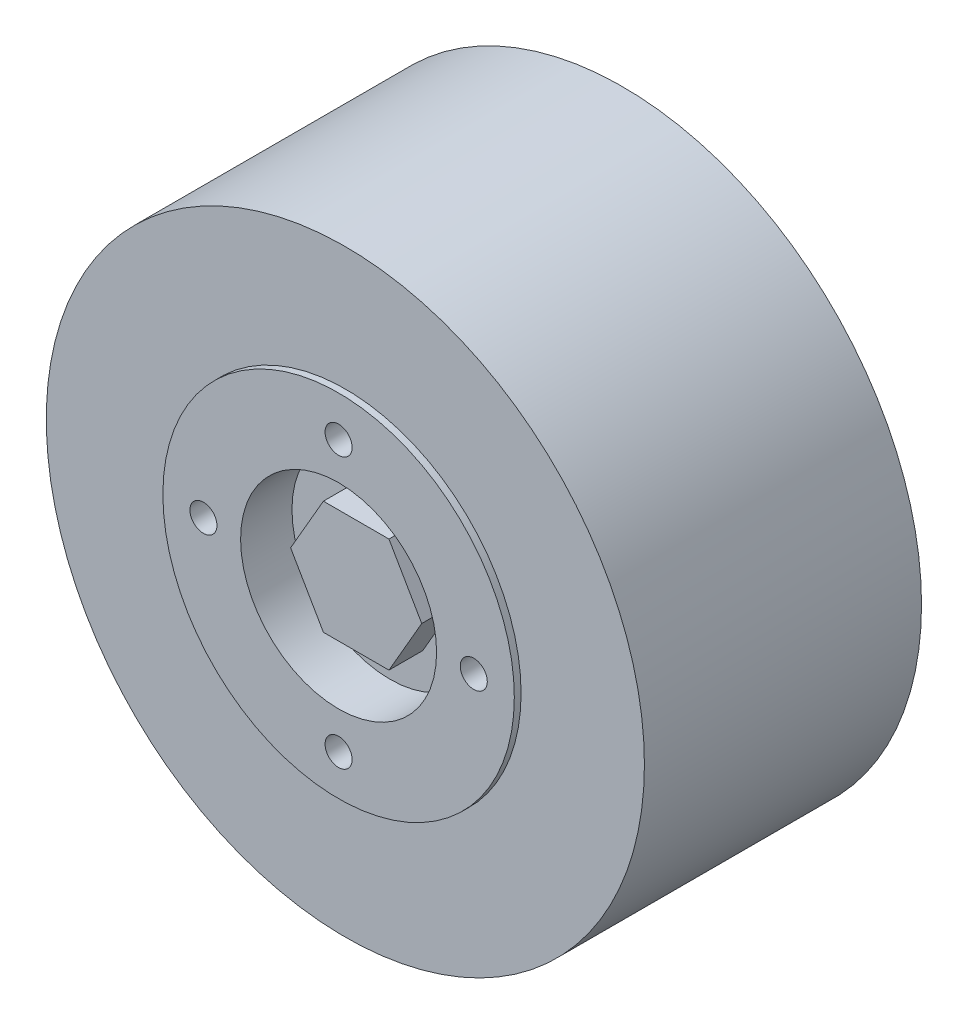
ISO-10303-21;
HEADER;
FILE_DESCRIPTION(('STEP AP214'),'2;1');
FILE_NAME('part.step','',(''),(''),'','','');
FILE_SCHEMA(('AUTOMOTIVE_DESIGN { 1 0 10303 214 1 1 1 1 }'));
ENDSEC;
DATA;
#1=APPLICATION_CONTEXT('core data for automotive mechanical design processes');
#2=APPLICATION_PROTOCOL_DEFINITION('international standard','automotive_design',2000,#1);
#3=PRODUCT_CONTEXT('',#1,'mechanical');
#4=PRODUCT('Part','Part','',(#3));
#5=PRODUCT_RELATED_PRODUCT_CATEGORY('part','',(#4));
#6=PRODUCT_DEFINITION_FORMATION('','',#4);
#7=PRODUCT_DEFINITION_CONTEXT('part definition',#1,'design');
#8=PRODUCT_DEFINITION('design','',#6,#7);
#9=PRODUCT_DEFINITION_SHAPE('','',#8);
#10=(LENGTH_UNIT() NAMED_UNIT(*) SI_UNIT(.MILLI.,.METRE.));
#11=(NAMED_UNIT(*) PLANE_ANGLE_UNIT() SI_UNIT($,.RADIAN.));
#12=(NAMED_UNIT(*) SI_UNIT($,.STERADIAN.) SOLID_ANGLE_UNIT());
#13=UNCERTAINTY_MEASURE_WITH_UNIT(LENGTH_MEASURE(1.E-05),#10,'distance_accuracy_value','');
#14=(GEOMETRIC_REPRESENTATION_CONTEXT(3) GLOBAL_UNCERTAINTY_ASSIGNED_CONTEXT((#13)) GLOBAL_UNIT_ASSIGNED_CONTEXT((#10,
#11,#12)) REPRESENTATION_CONTEXT('',''));
#15=CARTESIAN_POINT('',(0.,0.,0.));
#16=DIRECTION('',(0.,0.,1.));
#17=DIRECTION('',(1.,0.,0.));
#18=AXIS2_PLACEMENT_3D('',#15,#16,#17);
#19=CARTESIAN_POINT('',(0.,0.,34.4));
#20=DIRECTION('',(0.,0.,1.));
#21=DIRECTION('',(1.,0.,0.));
#22=AXIS2_PLACEMENT_3D('',#19,#20,#21);
#23=PLANE('',#22);
#24=CARTESIAN_POINT('',(0.,0.,34.4));
#25=DIRECTION('',(0.,0.,1.));
#26=DIRECTION('',(1.,0.,0.));
#27=AXIS2_PLACEMENT_3D('',#24,#25,#26);
#28=CIRCLE('',#27,14.5);
#29=CARTESIAN_POINT('',(14.5,0.,34.4));
#30=VERTEX_POINT('',#29);
#31=EDGE_CURVE('E166',#30,#30,#28,.T.);
#32=ORIENTED_EDGE('',*,*,#31,.T.);
#33=EDGE_LOOP('',(#32));
#34=FACE_BOUND('',#33,.T.);
#35=DIRECTION('',(-0.5,0.866025403784439,0.));
#36=VECTOR('',#35,1.);
#37=CARTESIAN_POINT('',(9.69948452238571,0.,34.4));
#38=LINE('',#37,#36);
#39=CARTESIAN_POINT('',(9.69948452238571,0.,34.4));
#40=VERTEX_POINT('',#39);
#41=CARTESIAN_POINT('',(4.84974226119285,8.40000000000001,34.4));
#42=VERTEX_POINT('',#41);
#43=EDGE_CURVE('E138',#40,#42,#38,.T.);
#44=ORIENTED_EDGE('',*,*,#43,.F.);
#45=DIRECTION('',(0.5,0.866025403784439,0.));
#46=VECTOR('',#45,1.);
#47=CARTESIAN_POINT('',(4.84974226119285,-8.40000000000001,34.4));
#48=LINE('',#47,#46);
#49=CARTESIAN_POINT('',(4.84974226119285,-8.40000000000001,34.4));
#50=VERTEX_POINT('',#49);
#51=EDGE_CURVE('E134',#50,#40,#48,.T.);
#52=ORIENTED_EDGE('',*,*,#51,.F.);
#53=DIRECTION('',(1.,0.,0.));
#54=VECTOR('',#53,1.);
#55=CARTESIAN_POINT('',(-4.84974226119286,-8.40000000000001,34.4));
#56=LINE('',#55,#54);
#57=CARTESIAN_POINT('',(-4.84974226119286,-8.40000000000001,34.4));
#58=VERTEX_POINT('',#57);
#59=EDGE_CURVE('E89',#58,#50,#56,.T.);
#60=ORIENTED_EDGE('',*,*,#59,.F.);
#61=DIRECTION('',(0.5,-0.866025403784438,0.));
#62=VECTOR('',#61,1.);
#63=CARTESIAN_POINT('',(-9.69948452238572,0.,34.4));
#64=LINE('',#63,#62);
#65=CARTESIAN_POINT('',(-9.69948452238572,0.,34.4));
#66=VERTEX_POINT('',#65);
#67=EDGE_CURVE('E146',#66,#58,#64,.T.);
#68=ORIENTED_EDGE('',*,*,#67,.F.);
#69=DIRECTION('',(-0.5,-0.866025403784439,0.));
#70=VECTOR('',#69,1.);
#71=CARTESIAN_POINT('',(-4.84974226119286,8.40000000000001,34.4));
#72=LINE('',#71,#70);
#73=CARTESIAN_POINT('',(-4.84974226119286,8.40000000000001,34.4));
#74=VERTEX_POINT('',#73);
#75=EDGE_CURVE('E120',#74,#66,#72,.T.);
#76=ORIENTED_EDGE('',*,*,#75,.F.);
#77=DIRECTION('',(-1.,0.,0.));
#78=VECTOR('',#77,1.);
#79=CARTESIAN_POINT('',(4.84974226119285,8.40000000000001,34.4));
#80=LINE('',#79,#78);
#81=EDGE_CURVE('E141',#42,#74,#80,.T.);
#82=ORIENTED_EDGE('',*,*,#81,.F.);
#83=EDGE_LOOP('',(#44,#52,#60,#68,#76,#82));
#84=FACE_BOUND('',#83,.T.);
#85=ADVANCED_FACE('F43',(#34,#84),#23,.T.);
#86=CARTESIAN_POINT('',(0.,0.,41.));
#87=DIRECTION('',(0.,0.,-1.));
#88=DIRECTION('',(-1.,0.,0.));
#89=AXIS2_PLACEMENT_3D('',#86,#87,#88);
#90=CYLINDRICAL_SURFACE('',#89,44.25);
#91=CARTESIAN_POINT('',(0.,0.,41.));
#92=DIRECTION('',(0.,0.,1.));
#93=DIRECTION('',(1.,0.,0.));
#94=AXIS2_PLACEMENT_3D('',#91,#92,#93);
#95=CIRCLE('',#94,44.25);
#96=CARTESIAN_POINT('',(44.25,0.,41.));
#97=VERTEX_POINT('',#96);
#98=EDGE_CURVE('E255',#97,#97,#95,.T.);
#99=ORIENTED_EDGE('',*,*,#98,.F.);
#100=EDGE_LOOP('',(#99));
#101=FACE_BOUND('',#100,.T.);
#102=CARTESIAN_POINT('',(0.,0.,0.));
#103=DIRECTION('',(0.,0.,1.));
#104=DIRECTION('',(1.,0.,0.));
#105=AXIS2_PLACEMENT_3D('',#102,#103,#104);
#106=CIRCLE('',#105,44.25);
#107=CARTESIAN_POINT('',(44.25,0.,0.));
#108=VERTEX_POINT('',#107);
#109=EDGE_CURVE('E47',#108,#108,#106,.T.);
#110=ORIENTED_EDGE('',*,*,#109,.T.);
#111=EDGE_LOOP('',(#110));
#112=FACE_BOUND('',#111,.T.);
#113=ADVANCED_FACE('F45',(#101,#112),#90,.T.);
#114=CARTESIAN_POINT('',(0.,0.,41.));
#115=DIRECTION('',(0.,0.,1.));
#116=DIRECTION('',(1.,0.,0.));
#117=AXIS2_PLACEMENT_3D('',#114,#115,#116);
#118=PLANE('',#117);
#119=CARTESIAN_POINT('',(0.,0.,41.));
#120=DIRECTION('',(0.,0.,1.));
#121=DIRECTION('',(1.,0.,0.));
#122=AXIS2_PLACEMENT_3D('',#119,#120,#121);
#123=CIRCLE('',#122,26.);
#124=CARTESIAN_POINT('',(26.,0.,41.));
#125=VERTEX_POINT('',#124);
#126=EDGE_CURVE('E53',#125,#125,#123,.T.);
#127=ORIENTED_EDGE('',*,*,#126,.F.);
#128=EDGE_LOOP('',(#127));
#129=FACE_BOUND('',#128,.T.);
#130=ORIENTED_EDGE('',*,*,#98,.T.);
#131=EDGE_LOOP('',(#130));
#132=FACE_BOUND('',#131,.T.);
#133=ADVANCED_FACE('F268',(#129,#132),#118,.T.);
#134=CARTESIAN_POINT('',(0.,0.,0.));
#135=DIRECTION('',(0.,0.,1.));
#136=DIRECTION('',(1.,0.,0.));
#137=AXIS2_PLACEMENT_3D('',#134,#135,#136);
#138=PLANE('',#137);
#139=CARTESIAN_POINT('',(0.,0.,0.));
#140=DIRECTION('',(0.,0.,-1.));
#141=DIRECTION('',(-1.,0.,0.));
#142=AXIS2_PLACEMENT_3D('',#139,#140,#141);
#143=CIRCLE('',#142,21.);
#144=CARTESIAN_POINT('',(-21.,0.,0.));
#145=VERTEX_POINT('',#144);
#146=EDGE_CURVE('E11',#145,#145,#143,.T.);
#147=ORIENTED_EDGE('',*,*,#146,.F.);
#148=EDGE_LOOP('',(#147));
#149=FACE_BOUND('',#148,.T.);
#150=ORIENTED_EDGE('',*,*,#109,.F.);
#151=EDGE_LOOP('',(#150));
#152=FACE_BOUND('',#151,.T.);
#153=ADVANCED_FACE('F265',(#149,#152),#138,.F.);
#154=CARTESIAN_POINT('',(0.,0.,42.));
#155=DIRECTION('',(0.,0.,-1.));
#156=DIRECTION('',(-1.,0.,0.));
#157=AXIS2_PLACEMENT_3D('',#154,#155,#156);
#158=CYLINDRICAL_SURFACE('',#157,26.);
#159=CARTESIAN_POINT('',(0.,0.,42.));
#160=DIRECTION('',(0.,0.,1.));
#161=DIRECTION('',(1.,0.,0.));
#162=AXIS2_PLACEMENT_3D('',#159,#160,#161);
#163=CIRCLE('',#162,26.);
#164=CARTESIAN_POINT('',(26.,0.,42.));
#165=VERTEX_POINT('',#164);
#166=EDGE_CURVE('E222',#165,#165,#163,.T.);
#167=ORIENTED_EDGE('',*,*,#166,.F.);
#168=EDGE_LOOP('',(#167));
#169=FACE_BOUND('',#168,.T.);
#170=ORIENTED_EDGE('',*,*,#126,.T.);
#171=EDGE_LOOP('',(#170));
#172=FACE_BOUND('',#171,.T.);
#173=ADVANCED_FACE('F267',(#169,#172),#158,.T.);
#174=CARTESIAN_POINT('',(0.,0.,42.));
#175=DIRECTION('',(0.,0.,1.));
#176=DIRECTION('',(1.,0.,0.));
#177=AXIS2_PLACEMENT_3D('',#174,#175,#176);
#178=PLANE('',#177);
#179=CARTESIAN_POINT('',(0.,0.,42.));
#180=DIRECTION('',(0.,0.,1.));
#181=DIRECTION('',(1.,0.,0.));
#182=AXIS2_PLACEMENT_3D('',#179,#180,#181);
#183=CIRCLE('',#182,14.5);
#184=CARTESIAN_POINT('',(14.5,0.,42.));
#185=VERTEX_POINT('',#184);
#186=EDGE_CURVE('E165',#185,#185,#183,.T.);
#187=ORIENTED_EDGE('',*,*,#186,.F.);
#188=EDGE_LOOP('',(#187));
#189=FACE_BOUND('',#188,.T.);
#190=CARTESIAN_POINT('',(0.,20.,42.));
#191=DIRECTION('',(0.,0.,1.));
#192=DIRECTION('',(1.,0.,0.));
#193=AXIS2_PLACEMENT_3D('',#190,#191,#192);
#194=CIRCLE('',#193,2.);
#195=CARTESIAN_POINT('',(2.,20.,42.));
#196=VERTEX_POINT('',#195);
#197=EDGE_CURVE('E223',#196,#196,#194,.T.);
#198=ORIENTED_EDGE('',*,*,#197,.F.);
#199=EDGE_LOOP('',(#198));
#200=FACE_BOUND('',#199,.T.);
#201=CARTESIAN_POINT('',(20.,0.,42.));
#202=DIRECTION('',(0.,0.,1.));
#203=DIRECTION('',(1.,0.,0.));
#204=AXIS2_PLACEMENT_3D('',#201,#202,#203);
#205=CIRCLE('',#204,2.);
#206=CARTESIAN_POINT('',(22.,0.,42.));
#207=VERTEX_POINT('',#206);
#208=EDGE_CURVE('E227',#207,#207,#205,.T.);
#209=ORIENTED_EDGE('',*,*,#208,.F.);
#210=EDGE_LOOP('',(#209));
#211=FACE_BOUND('',#210,.T.);
#212=CARTESIAN_POINT('',(0.,-20.,42.));
#213=DIRECTION('',(0.,0.,1.));
#214=DIRECTION('',(1.,0.,0.));
#215=AXIS2_PLACEMENT_3D('',#212,#213,#214);
#216=CIRCLE('',#215,2.);
#217=CARTESIAN_POINT('',(2.,-20.,42.));
#218=VERTEX_POINT('',#217);
#219=EDGE_CURVE('E235',#218,#218,#216,.T.);
#220=ORIENTED_EDGE('',*,*,#219,.F.);
#221=EDGE_LOOP('',(#220));
#222=FACE_BOUND('',#221,.T.);
#223=CARTESIAN_POINT('',(-20.,0.,42.));
#224=DIRECTION('',(0.,0.,1.));
#225=DIRECTION('',(1.,0.,0.));
#226=AXIS2_PLACEMENT_3D('',#223,#224,#225);
#227=CIRCLE('',#226,2.);
#228=CARTESIAN_POINT('',(-18.,0.,42.));
#229=VERTEX_POINT('',#228);
#230=EDGE_CURVE('E243',#229,#229,#227,.T.);
#231=ORIENTED_EDGE('',*,*,#230,.F.);
#232=EDGE_LOOP('',(#231));
#233=FACE_BOUND('',#232,.T.);
#234=ORIENTED_EDGE('',*,*,#166,.T.);
#235=EDGE_LOOP('',(#234));
#236=FACE_BOUND('',#235,.T.);
#237=ADVANCED_FACE('F274',(#189,#200,#211,#222,#233,#236),#178,.T.);
#238=CARTESIAN_POINT('',(-20.,0.,32.));
#239=DIRECTION('',(0.,0.,1.));
#240=DIRECTION('',(1.,0.,0.));
#241=AXIS2_PLACEMENT_3D('',#238,#239,#240);
#242=CYLINDRICAL_SURFACE('',#241,2.);
#243=CARTESIAN_POINT('',(-20.,0.,32.));
#244=DIRECTION('',(0.,0.,1.));
#245=DIRECTION('',(1.,0.,0.));
#246=AXIS2_PLACEMENT_3D('',#243,#244,#245);
#247=CIRCLE('',#246,2.);
#248=CARTESIAN_POINT('',(-18.,0.,32.));
#249=VERTEX_POINT('',#248);
#250=EDGE_CURVE('E216',#249,#249,#247,.T.);
#251=ORIENTED_EDGE('',*,*,#250,.F.);
#252=EDGE_LOOP('',(#251));
#253=FACE_BOUND('',#252,.T.);
#254=ORIENTED_EDGE('',*,*,#230,.T.);
#255=EDGE_LOOP('',(#254));
#256=FACE_BOUND('',#255,.T.);
#257=ADVANCED_FACE('F369',(#253,#256),#242,.F.);
#258=CARTESIAN_POINT('',(-20.,0.,32.));
#259=DIRECTION('',(0.,0.,1.));
#260=DIRECTION('',(1.,0.,0.));
#261=AXIS2_PLACEMENT_3D('',#258,#259,#260);
#262=PLANE('',#261);
#263=ORIENTED_EDGE('',*,*,#250,.T.);
#264=EDGE_LOOP('',(#263));
#265=FACE_BOUND('',#264,.T.);
#266=ADVANCED_FACE('F364',(#265),#262,.T.);
#267=CARTESIAN_POINT('',(0.,-20.,32.));
#268=DIRECTION('',(0.,0.,1.));
#269=DIRECTION('',(1.,0.,0.));
#270=AXIS2_PLACEMENT_3D('',#267,#268,#269);
#271=CYLINDRICAL_SURFACE('',#270,2.);
#272=CARTESIAN_POINT('',(0.,-20.,32.));
#273=DIRECTION('',(0.,0.,1.));
#274=DIRECTION('',(1.,0.,0.));
#275=AXIS2_PLACEMENT_3D('',#272,#273,#274);
#276=CIRCLE('',#275,2.);
#277=CARTESIAN_POINT('',(2.,-20.,32.));
#278=VERTEX_POINT('',#277);
#279=EDGE_CURVE('E239',#278,#278,#276,.T.);
#280=ORIENTED_EDGE('',*,*,#279,.F.);
#281=EDGE_LOOP('',(#280));
#282=FACE_BOUND('',#281,.T.);
#283=ORIENTED_EDGE('',*,*,#219,.T.);
#284=EDGE_LOOP('',(#283));
#285=FACE_BOUND('',#284,.T.);
#286=ADVANCED_FACE('F361',(#282,#285),#271,.F.);
#287=CARTESIAN_POINT('',(0.,-20.,32.));
#288=DIRECTION('',(0.,0.,1.));
#289=DIRECTION('',(1.,0.,0.));
#290=AXIS2_PLACEMENT_3D('',#287,#288,#289);
#291=PLANE('',#290);
#292=ORIENTED_EDGE('',*,*,#279,.T.);
#293=EDGE_LOOP('',(#292));
#294=FACE_BOUND('',#293,.T.);
#295=ADVANCED_FACE('F356',(#294),#291,.T.);
#296=CARTESIAN_POINT('',(20.,0.,32.));
#297=DIRECTION('',(0.,0.,1.));
#298=DIRECTION('',(1.,0.,0.));
#299=AXIS2_PLACEMENT_3D('',#296,#297,#298);
#300=CYLINDRICAL_SURFACE('',#299,2.);
#301=CARTESIAN_POINT('',(20.,0.,32.));
#302=DIRECTION('',(0.,0.,1.));
#303=DIRECTION('',(1.,0.,0.));
#304=AXIS2_PLACEMENT_3D('',#301,#302,#303);
#305=CIRCLE('',#304,2.);
#306=CARTESIAN_POINT('',(22.,0.,32.));
#307=VERTEX_POINT('',#306);
#308=EDGE_CURVE('E231',#307,#307,#305,.T.);
#309=ORIENTED_EDGE('',*,*,#308,.F.);
#310=EDGE_LOOP('',(#309));
#311=FACE_BOUND('',#310,.T.);
#312=ORIENTED_EDGE('',*,*,#208,.T.);
#313=EDGE_LOOP('',(#312));
#314=FACE_BOUND('',#313,.T.);
#315=ADVANCED_FACE('F353',(#311,#314),#300,.F.);
#316=CARTESIAN_POINT('',(20.,0.,32.));
#317=DIRECTION('',(0.,0.,1.));
#318=DIRECTION('',(1.,0.,0.));
#319=AXIS2_PLACEMENT_3D('',#316,#317,#318);
#320=PLANE('',#319);
#321=ORIENTED_EDGE('',*,*,#308,.T.);
#322=EDGE_LOOP('',(#321));
#323=FACE_BOUND('',#322,.T.);
#324=ADVANCED_FACE('F351',(#323),#320,.T.);
#325=CARTESIAN_POINT('',(0.,20.,32.));
#326=DIRECTION('',(0.,0.,1.));
#327=DIRECTION('',(1.,0.,0.));
#328=AXIS2_PLACEMENT_3D('',#325,#326,#327);
#329=CYLINDRICAL_SURFACE('',#328,2.);
#330=CARTESIAN_POINT('',(0.,20.,32.));
#331=DIRECTION('',(0.,0.,1.));
#332=DIRECTION('',(1.,0.,0.));
#333=AXIS2_PLACEMENT_3D('',#330,#331,#332);
#334=CIRCLE('',#333,2.);
#335=CARTESIAN_POINT('',(2.,20.,32.));
#336=VERTEX_POINT('',#335);
#337=EDGE_CURVE('E218',#336,#336,#334,.T.);
#338=ORIENTED_EDGE('',*,*,#337,.F.);
#339=EDGE_LOOP('',(#338));
#340=FACE_BOUND('',#339,.T.);
#341=ORIENTED_EDGE('',*,*,#197,.T.);
#342=EDGE_LOOP('',(#341));
#343=FACE_BOUND('',#342,.T.);
#344=ADVANCED_FACE('F347',(#340,#343),#329,.F.);
#345=CARTESIAN_POINT('',(0.,20.,32.));
#346=DIRECTION('',(0.,0.,1.));
#347=DIRECTION('',(1.,0.,0.));
#348=AXIS2_PLACEMENT_3D('',#345,#346,#347);
#349=PLANE('',#348);
#350=ORIENTED_EDGE('',*,*,#337,.T.);
#351=EDGE_LOOP('',(#350));
#352=FACE_BOUND('',#351,.T.);
#353=ADVANCED_FACE('F343',(#352),#349,.T.);
#354=CARTESIAN_POINT('',(0.,0.,-1.));
#355=DIRECTION('',(0.,0.,1.));
#356=DIRECTION('',(1.,0.,0.));
#357=AXIS2_PLACEMENT_3D('',#354,#355,#356);
#358=CYLINDRICAL_SURFACE('',#357,21.);
#359=CARTESIAN_POINT('',(0.,0.,-1.));
#360=DIRECTION('',(0.,0.,-1.));
#361=DIRECTION('',(-1.,0.,0.));
#362=AXIS2_PLACEMENT_3D('',#359,#360,#361);
#363=CIRCLE('',#362,21.);
#364=CARTESIAN_POINT('',(-21.,0.,-1.));
#365=VERTEX_POINT('',#364);
#366=EDGE_CURVE('E210',#365,#365,#363,.T.);
#367=ORIENTED_EDGE('',*,*,#366,.F.);
#368=EDGE_LOOP('',(#367));
#369=FACE_BOUND('',#368,.T.);
#370=ORIENTED_EDGE('',*,*,#146,.T.);
#371=EDGE_LOOP('',(#370));
#372=FACE_BOUND('',#371,.T.);
#373=ADVANCED_FACE('F339',(#369,#372),#358,.T.);
#374=CARTESIAN_POINT('',(0.,0.,-1.));
#375=DIRECTION('',(0.,0.,-1.));
#376=DIRECTION('',(-1.,0.,0.));
#377=AXIS2_PLACEMENT_3D('',#374,#375,#376);
#378=PLANE('',#377);
#379=CARTESIAN_POINT('',(0.,0.,-1.));
#380=DIRECTION('',(0.,0.,-1.));
#381=DIRECTION('',(-1.,0.,0.));
#382=AXIS2_PLACEMENT_3D('',#379,#380,#381);
#383=CIRCLE('',#382,1.5);
#384=CARTESIAN_POINT('',(-1.5,0.,-1.));
#385=VERTEX_POINT('',#384);
#386=EDGE_CURVE('E170',#385,#385,#383,.T.);
#387=ORIENTED_EDGE('',*,*,#386,.F.);
#388=EDGE_LOOP('',(#387));
#389=FACE_BOUND('',#388,.T.);
#390=CARTESIAN_POINT('',(-15.5,0.,-1.));
#391=DIRECTION('',(0.,0.,-1.));
#392=DIRECTION('',(0.,-1.,0.));
#393=AXIS2_PLACEMENT_3D('',#390,#391,#392);
#394=CIRCLE('',#393,1.5);
#395=CARTESIAN_POINT('',(-15.5,-1.50000000000005,-1.));
#396=VERTEX_POINT('',#395);
#397=EDGE_CURVE('E187',#396,#396,#394,.T.);
#398=ORIENTED_EDGE('',*,*,#397,.F.);
#399=EDGE_LOOP('',(#398));
#400=FACE_BOUND('',#399,.T.);
#401=CARTESIAN_POINT('',(0.,-15.5,-1.));
#402=DIRECTION('',(0.,0.,-1.));
#403=DIRECTION('',(1.,0.,0.));
#404=AXIS2_PLACEMENT_3D('',#401,#402,#403);
#405=CIRCLE('',#404,1.5);
#406=CARTESIAN_POINT('',(1.5,-15.5,-1.));
#407=VERTEX_POINT('',#406);
#408=EDGE_CURVE('E195',#407,#407,#405,.T.);
#409=ORIENTED_EDGE('',*,*,#408,.F.);
#410=EDGE_LOOP('',(#409));
#411=FACE_BOUND('',#410,.T.);
#412=CARTESIAN_POINT('',(15.5,1.62353882256206E-13,-1.));
#413=DIRECTION('',(0.,0.,-1.));
#414=DIRECTION('',(0.,1.,0.));
#415=AXIS2_PLACEMENT_3D('',#412,#413,#414);
#416=CIRCLE('',#415,1.5);
#417=CARTESIAN_POINT('',(15.5,1.50000000000016,-1.));
#418=VERTEX_POINT('',#417);
#419=EDGE_CURVE('E178',#418,#418,#416,.T.);
#420=ORIENTED_EDGE('',*,*,#419,.F.);
#421=EDGE_LOOP('',(#420));
#422=FACE_BOUND('',#421,.T.);
#423=CARTESIAN_POINT('',(0.,15.5,-1.));
#424=DIRECTION('',(0.,0.,-1.));
#425=DIRECTION('',(-1.,0.,0.));
#426=AXIS2_PLACEMENT_3D('',#423,#424,#425);
#427=CIRCLE('',#426,1.5);
#428=CARTESIAN_POINT('',(-1.5,15.5,-1.));
#429=VERTEX_POINT('',#428);
#430=EDGE_CURVE('E186',#429,#429,#427,.T.);
#431=ORIENTED_EDGE('',*,*,#430,.F.);
#432=EDGE_LOOP('',(#431));
#433=FACE_BOUND('',#432,.T.);
#434=ORIENTED_EDGE('',*,*,#366,.T.);
#435=EDGE_LOOP('',(#434));
#436=FACE_BOUND('',#435,.T.);
#437=ADVANCED_FACE('F335',(#389,#400,#411,#422,#433,#436),#378,.T.);
#438=CARTESIAN_POINT('',(0.,15.5,9.));
#439=DIRECTION('',(0.,0.,-1.));
#440=DIRECTION('',(-1.,0.,0.));
#441=AXIS2_PLACEMENT_3D('',#438,#439,#440);
#442=CYLINDRICAL_SURFACE('',#441,1.5);
#443=CARTESIAN_POINT('',(0.,15.5,9.));
#444=DIRECTION('',(0.,0.,-1.));
#445=DIRECTION('',(-1.,0.,0.));
#446=AXIS2_PLACEMENT_3D('',#443,#444,#445);
#447=CIRCLE('',#446,1.5);
#448=CARTESIAN_POINT('',(-1.5,15.5,9.));
#449=VERTEX_POINT('',#448);
#450=EDGE_CURVE('E206',#449,#449,#447,.T.);
#451=ORIENTED_EDGE('',*,*,#450,.F.);
#452=EDGE_LOOP('',(#451));
#453=FACE_BOUND('',#452,.T.);
#454=ORIENTED_EDGE('',*,*,#430,.T.);
#455=EDGE_LOOP('',(#454));
#456=FACE_BOUND('',#455,.T.);
#457=ADVANCED_FACE('F331',(#453,#456),#442,.F.);
#458=CARTESIAN_POINT('',(0.,15.5,9.));
#459=DIRECTION('',(0.,0.,-1.));
#460=DIRECTION('',(-1.,0.,0.));
#461=AXIS2_PLACEMENT_3D('',#458,#459,#460);
#462=PLANE('',#461);
#463=ORIENTED_EDGE('',*,*,#450,.T.);
#464=EDGE_LOOP('',(#463));
#465=FACE_BOUND('',#464,.T.);
#466=ADVANCED_FACE('F327',(#465),#462,.T.);
#467=CARTESIAN_POINT('',(15.5,1.62353882256206E-13,9.));
#468=DIRECTION('',(0.,0.,-1.));
#469=DIRECTION('',(-1.,0.,0.));
#470=AXIS2_PLACEMENT_3D('',#467,#468,#469);
#471=CYLINDRICAL_SURFACE('',#470,1.5);
#472=CARTESIAN_POINT('',(15.5,1.62353882256206E-13,9.));
#473=DIRECTION('',(0.,0.,-1.));
#474=DIRECTION('',(0.,1.,0.));
#475=AXIS2_PLACEMENT_3D('',#472,#473,#474);
#476=CIRCLE('',#475,1.5);
#477=CARTESIAN_POINT('',(15.5,1.50000000000016,9.));
#478=VERTEX_POINT('',#477);
#479=EDGE_CURVE('E199',#478,#478,#476,.T.);
#480=ORIENTED_EDGE('',*,*,#479,.F.);
#481=EDGE_LOOP('',(#480));
#482=FACE_BOUND('',#481,.T.);
#483=ORIENTED_EDGE('',*,*,#419,.T.);
#484=EDGE_LOOP('',(#483));
#485=FACE_BOUND('',#484,.T.);
#486=ADVANCED_FACE('F323',(#482,#485),#471,.F.);
#487=CARTESIAN_POINT('',(15.5,1.62353882256206E-13,9.));
#488=DIRECTION('',(0.,0.,-1.));
#489=DIRECTION('',(0.,1.,0.));
#490=AXIS2_PLACEMENT_3D('',#487,#488,#489);
#491=PLANE('',#490);
#492=ORIENTED_EDGE('',*,*,#479,.T.);
#493=EDGE_LOOP('',(#492));
#494=FACE_BOUND('',#493,.T.);
#495=ADVANCED_FACE('F319',(#494),#491,.T.);
#496=CARTESIAN_POINT('',(0.,-15.5,9.));
#497=DIRECTION('',(0.,0.,-1.));
#498=DIRECTION('',(-1.,0.,0.));
#499=AXIS2_PLACEMENT_3D('',#496,#497,#498);
#500=CYLINDRICAL_SURFACE('',#499,1.5);
#501=CARTESIAN_POINT('',(0.,-15.5,9.));
#502=DIRECTION('',(0.,0.,-1.));
#503=DIRECTION('',(1.,0.,0.));
#504=AXIS2_PLACEMENT_3D('',#501,#502,#503);
#505=CIRCLE('',#504,1.5);
#506=CARTESIAN_POINT('',(1.5,-15.5,9.));
#507=VERTEX_POINT('',#506);
#508=EDGE_CURVE('E191',#507,#507,#505,.T.);
#509=ORIENTED_EDGE('',*,*,#508,.F.);
#510=EDGE_LOOP('',(#509));
#511=FACE_BOUND('',#510,.T.);
#512=ORIENTED_EDGE('',*,*,#408,.T.);
#513=EDGE_LOOP('',(#512));
#514=FACE_BOUND('',#513,.T.);
#515=ADVANCED_FACE('F315',(#511,#514),#500,.F.);
#516=CARTESIAN_POINT('',(0.,-15.5,9.));
#517=DIRECTION('',(0.,0.,-1.));
#518=DIRECTION('',(1.,0.,0.));
#519=AXIS2_PLACEMENT_3D('',#516,#517,#518);
#520=PLANE('',#519);
#521=ORIENTED_EDGE('',*,*,#508,.T.);
#522=EDGE_LOOP('',(#521));
#523=FACE_BOUND('',#522,.T.);
#524=ADVANCED_FACE('F311',(#523),#520,.T.);
#525=CARTESIAN_POINT('',(-15.5,0.,9.));
#526=DIRECTION('',(0.,0.,-1.));
#527=DIRECTION('',(-1.,0.,0.));
#528=AXIS2_PLACEMENT_3D('',#525,#526,#527);
#529=CYLINDRICAL_SURFACE('',#528,1.5);
#530=CARTESIAN_POINT('',(-15.5,0.,9.));
#531=DIRECTION('',(0.,0.,-1.));
#532=DIRECTION('',(0.,-1.,0.));
#533=AXIS2_PLACEMENT_3D('',#530,#531,#532);
#534=CIRCLE('',#533,1.5);
#535=CARTESIAN_POINT('',(-15.5,-1.50000000000005,9.));
#536=VERTEX_POINT('',#535);
#537=EDGE_CURVE('E182',#536,#536,#534,.T.);
#538=ORIENTED_EDGE('',*,*,#537,.F.);
#539=EDGE_LOOP('',(#538));
#540=FACE_BOUND('',#539,.T.);
#541=ORIENTED_EDGE('',*,*,#397,.T.);
#542=EDGE_LOOP('',(#541));
#543=FACE_BOUND('',#542,.T.);
#544=ADVANCED_FACE('F307',(#540,#543),#529,.F.);
#545=CARTESIAN_POINT('',(-15.5,0.,9.));
#546=DIRECTION('',(0.,0.,-1.));
#547=DIRECTION('',(0.,-1.,0.));
#548=AXIS2_PLACEMENT_3D('',#545,#546,#547);
#549=PLANE('',#548);
#550=ORIENTED_EDGE('',*,*,#537,.T.);
#551=EDGE_LOOP('',(#550));
#552=FACE_BOUND('',#551,.T.);
#553=ADVANCED_FACE('F303',(#552),#549,.T.);
#554=CARTESIAN_POINT('',(0.,0.,-7.));
#555=DIRECTION('',(0.,0.,1.));
#556=DIRECTION('',(1.,0.,0.));
#557=AXIS2_PLACEMENT_3D('',#554,#555,#556);
#558=CYLINDRICAL_SURFACE('',#557,1.5);
#559=CARTESIAN_POINT('',(0.,0.,-7.));
#560=DIRECTION('',(0.,0.,-1.));
#561=DIRECTION('',(-1.,0.,0.));
#562=AXIS2_PLACEMENT_3D('',#559,#560,#561);
#563=CIRCLE('',#562,1.5);
#564=CARTESIAN_POINT('',(-1.5,0.,-7.));
#565=VERTEX_POINT('',#564);
#566=EDGE_CURVE('E174',#565,#565,#563,.T.);
#567=ORIENTED_EDGE('',*,*,#566,.F.);
#568=EDGE_LOOP('',(#567));
#569=FACE_BOUND('',#568,.T.);
#570=ORIENTED_EDGE('',*,*,#386,.T.);
#571=EDGE_LOOP('',(#570));
#572=FACE_BOUND('',#571,.T.);
#573=ADVANCED_FACE('F299',(#569,#572),#558,.T.);
#574=CARTESIAN_POINT('',(0.,0.,-7.));
#575=DIRECTION('',(0.,0.,-1.));
#576=DIRECTION('',(-1.,0.,0.));
#577=AXIS2_PLACEMENT_3D('',#574,#575,#576);
#578=PLANE('',#577);
#579=ORIENTED_EDGE('',*,*,#566,.T.);
#580=EDGE_LOOP('',(#579));
#581=FACE_BOUND('',#580,.T.);
#582=ADVANCED_FACE('F295',(#581),#578,.T.);
#583=CARTESIAN_POINT('',(0.,0.,34.4));
#584=DIRECTION('',(0.,0.,1.));
#585=DIRECTION('',(1.,0.,0.));
#586=AXIS2_PLACEMENT_3D('',#583,#584,#585);
#587=CYLINDRICAL_SURFACE('',#586,14.5);
#588=CARTESIAN_POINT('',(14.5,0.,34.4));
#589=CARTESIAN_POINT('',(14.5,0.,34.4791666666667));
#590=CARTESIAN_POINT('',(14.5,0.,34.5583333333333));
#591=CARTESIAN_POINT('',(14.5,0.,34.7166666666667));
#592=CARTESIAN_POINT('',(14.5,0.,34.7958333333333));
#593=CARTESIAN_POINT('',(14.5,0.,34.9541666666667));
#594=CARTESIAN_POINT('',(14.5,0.,35.0333333333333));
#595=CARTESIAN_POINT('',(14.5,0.,35.1916666666667));
#596=CARTESIAN_POINT('',(14.5,0.,35.2708333333333));
#597=CARTESIAN_POINT('',(14.5,0.,35.4291666666667));
#598=CARTESIAN_POINT('',(14.5,0.,35.5083333333333));
#599=CARTESIAN_POINT('',(14.5,0.,35.6666666666667));
#600=CARTESIAN_POINT('',(14.5,0.,35.7458333333333));
#601=CARTESIAN_POINT('',(14.5,0.,35.9041666666667));
#602=CARTESIAN_POINT('',(14.5,0.,35.9833333333333));
#603=CARTESIAN_POINT('',(14.5,0.,36.1416666666667));
#604=CARTESIAN_POINT('',(14.5,0.,36.2208333333333));
#605=CARTESIAN_POINT('',(14.5,0.,36.3791666666667));
#606=CARTESIAN_POINT('',(14.5,0.,36.4583333333333));
#607=CARTESIAN_POINT('',(14.5,0.,36.6166666666667));
#608=CARTESIAN_POINT('',(14.5,0.,36.6958333333333));
#609=CARTESIAN_POINT('',(14.5,0.,36.8541666666667));
#610=CARTESIAN_POINT('',(14.5,0.,36.9333333333333));
#611=CARTESIAN_POINT('',(14.5,0.,37.0916666666667));
#612=CARTESIAN_POINT('',(14.5,0.,37.1708333333333));
#613=CARTESIAN_POINT('',(14.5,0.,37.3291666666667));
#614=CARTESIAN_POINT('',(14.5,0.,37.4083333333333));
#615=CARTESIAN_POINT('',(14.5,0.,37.5666666666667));
#616=CARTESIAN_POINT('',(14.5,0.,37.6458333333333));
#617=CARTESIAN_POINT('',(14.5,0.,37.8041666666667));
#618=CARTESIAN_POINT('',(14.5,0.,37.8833333333333));
#619=CARTESIAN_POINT('',(14.5,0.,38.0416666666667));
#620=CARTESIAN_POINT('',(14.5,0.,38.1208333333333));
#621=CARTESIAN_POINT('',(14.5,0.,38.2791666666667));
#622=CARTESIAN_POINT('',(14.5,0.,38.3583333333333));
#623=CARTESIAN_POINT('',(14.5,0.,38.5166666666667));
#624=CARTESIAN_POINT('',(14.5,0.,38.5958333333333));
#625=CARTESIAN_POINT('',(14.5,0.,38.7541666666667));
#626=CARTESIAN_POINT('',(14.5,0.,38.8333333333333));
#627=CARTESIAN_POINT('',(14.5,0.,38.9916666666667));
#628=CARTESIAN_POINT('',(14.5,0.,39.0708333333333));
#629=CARTESIAN_POINT('',(14.5,0.,39.2291666666667));
#630=CARTESIAN_POINT('',(14.5,0.,39.3083333333333));
#631=CARTESIAN_POINT('',(14.5,0.,39.4666666666667));
#632=CARTESIAN_POINT('',(14.5,0.,39.5458333333333));
#633=CARTESIAN_POINT('',(14.5,0.,39.7041666666667));
#634=CARTESIAN_POINT('',(14.5,0.,39.7833333333333));
#635=CARTESIAN_POINT('',(14.5,0.,39.9416666666667));
#636=CARTESIAN_POINT('',(14.5,0.,40.0208333333333));
#637=CARTESIAN_POINT('',(14.5,0.,40.1791666666667));
#638=CARTESIAN_POINT('',(14.5,0.,40.2583333333333));
#639=CARTESIAN_POINT('',(14.5,0.,40.4166666666667));
#640=CARTESIAN_POINT('',(14.5,0.,40.4958333333333));
#641=CARTESIAN_POINT('',(14.5,0.,40.6541666666667));
#642=CARTESIAN_POINT('',(14.5,0.,40.7333333333333));
#643=CARTESIAN_POINT('',(14.5,0.,40.8916666666667));
#644=CARTESIAN_POINT('',(14.5,0.,40.9708333333333));
#645=CARTESIAN_POINT('',(14.5,0.,41.1291666666667));
#646=CARTESIAN_POINT('',(14.5,0.,41.2083333333333));
#647=CARTESIAN_POINT('',(14.5,0.,41.3666666666667));
#648=CARTESIAN_POINT('',(14.5,0.,41.4458333333333));
#649=CARTESIAN_POINT('',(14.5,0.,41.6041666666667));
#650=CARTESIAN_POINT('',(14.5,0.,41.6833333333333));
#651=CARTESIAN_POINT('',(14.5,0.,41.8416666666667));
#652=CARTESIAN_POINT('',(14.5,0.,41.9208333333333));
#653=CARTESIAN_POINT('',(14.5,0.,42.));
#654=B_SPLINE_CURVE_WITH_KNOTS('',3,(#588,#589,#590,#591,#592,#593,#594,#595,#596,#597,#598,
#599,#600,#601,#602,#603,#604,#605,#606,#607,#608,#609,#610,#611,#612,#613,#614,#615,#616,#617,
#618,#619,#620,#621,#622,#623,#624,#625,#626,#627,#628,#629,#630,#631,#632,#633,#634,#635,#636,
#637,#638,#639,#640,#641,#642,#643,#644,#645,#646,#647,#648,#649,#650,#651,#652,#653),
.UNSPECIFIED.,.F.,.F.,(4,2,2,2,2,2,2,2,2,2,2,2,2,2,2,2,2,2,2,2,2,2,2,2,2,2,2,2,2,2,2,2,4),(0.,
0.237500000000002,0.475000000000003,0.712500000000005,0.950000000000006,1.1875,1.425,1.6625,
1.90000000000001,2.13750000000001,2.375,2.6125,2.85000000000001,3.08750000000001,3.325,3.5625,
3.8,4.03750000000001,4.27500000000001,4.5125,4.75,4.98750000000001,5.22500000000001,5.4625,5.7,
5.93750000000001,6.17500000000001,6.41250000000001,6.65000000000001,6.8875,7.12500000000001,
7.36250000000001,7.60000000000001),.UNSPECIFIED.);
#655=EDGE_CURVE('BSEAM292',#30,#185,#654,.T.);
#656=ORIENTED_EDGE('',*,*,#31,.F.);
#657=ORIENTED_EDGE('',*,*,#186,.T.);
#658=ORIENTED_EDGE('',*,*,#655,.T.);
#659=ORIENTED_EDGE('',*,*,#655,.F.);
#660=EDGE_LOOP('',(#656,#658,#657,#659));
#661=FACE_BOUND('',#660,.T.);
#662=ADVANCED_FACE('F292',(#661),#587,.F.);
#663=CARTESIAN_POINT('',(4.84974226119285,-8.40000000000001,39.4));
#664=DIRECTION('',(-0.866025403784439,0.5,0.));
#665=DIRECTION('',(-0.5,-0.866025403784439,0.));
#666=AXIS2_PLACEMENT_3D('',#663,#664,#665);
#667=PLANE('',#666);
#668=ORIENTED_EDGE('',*,*,#51,.T.);
#669=DIRECTION('',(0.,0.,-1.));
#670=VECTOR('',#669,1.);
#671=CARTESIAN_POINT('',(9.69948452238571,0.,39.4));
#672=LINE('',#671,#670);
#673=CARTESIAN_POINT('',(9.69948452238571,0.,39.4));
#674=VERTEX_POINT('',#673);
#675=EDGE_CURVE('E162',#674,#40,#672,.T.);
#676=ORIENTED_EDGE('',*,*,#675,.F.);
#677=DIRECTION('',(0.5,0.866025403784439,0.));
#678=VECTOR('',#677,1.);
#679=CARTESIAN_POINT('',(4.84974226119285,-8.40000000000001,39.4));
#680=LINE('',#679,#678);
#681=CARTESIAN_POINT('',(4.84974226119285,-8.40000000000001,39.4));
#682=VERTEX_POINT('',#681);
#683=EDGE_CURVE('E151',#682,#674,#680,.T.);
#684=ORIENTED_EDGE('',*,*,#683,.F.);
#685=DIRECTION('',(0.,0.,-1.));
#686=VECTOR('',#685,1.);
#687=CARTESIAN_POINT('',(4.84974226119285,-8.40000000000001,39.4));
#688=LINE('',#687,#686);
#689=EDGE_CURVE('E130',#682,#50,#688,.T.);
#690=ORIENTED_EDGE('',*,*,#689,.T.);
#691=EDGE_LOOP('',(#668,#676,#684,#690));
#692=FACE_BOUND('',#691,.T.);
#693=ADVANCED_FACE('F290',(#692),#667,.F.);
#694=CARTESIAN_POINT('',(9.69948452238571,0.,39.4));
#695=DIRECTION('',(-0.866025403784439,-0.5,0.));
#696=DIRECTION('',(0.5,-0.866025403784439,0.));
#697=AXIS2_PLACEMENT_3D('',#694,#695,#696);
#698=PLANE('',#697);
#699=ORIENTED_EDGE('',*,*,#43,.T.);
#700=DIRECTION('',(0.,0.,-1.));
#701=VECTOR('',#700,1.);
#702=CARTESIAN_POINT('',(4.84974226119285,8.40000000000001,39.4));
#703=LINE('',#702,#701);
#704=CARTESIAN_POINT('',(4.84974226119285,8.40000000000001,39.4));
#705=VERTEX_POINT('',#704);
#706=EDGE_CURVE('E158',#705,#42,#703,.T.);
#707=ORIENTED_EDGE('',*,*,#706,.F.);
#708=DIRECTION('',(-0.5,0.866025403784439,0.));
#709=VECTOR('',#708,1.);
#710=CARTESIAN_POINT('',(9.69948452238571,0.,39.4));
#711=LINE('',#710,#709);
#712=EDGE_CURVE('E97',#674,#705,#711,.T.);
#713=ORIENTED_EDGE('',*,*,#712,.F.);
#714=ORIENTED_EDGE('',*,*,#675,.T.);
#715=EDGE_LOOP('',(#699,#707,#713,#714));
#716=FACE_BOUND('',#715,.T.);
#717=ADVANCED_FACE('F490',(#716),#698,.F.);
#718=CARTESIAN_POINT('',(4.84974226119285,8.40000000000001,39.4));
#719=DIRECTION('',(0.,-1.,0.));
#720=DIRECTION('',(1.,0.,0.));
#721=AXIS2_PLACEMENT_3D('',#718,#719,#720);
#722=PLANE('',#721);
#723=ORIENTED_EDGE('',*,*,#81,.T.);
#724=DIRECTION('',(0.,0.,-1.));
#725=VECTOR('',#724,1.);
#726=CARTESIAN_POINT('',(-4.84974226119286,8.40000000000001,39.4));
#727=LINE('',#726,#725);
#728=CARTESIAN_POINT('',(-4.84974226119286,8.40000000000001,39.4));
#729=VERTEX_POINT('',#728);
#730=EDGE_CURVE('E124',#729,#74,#727,.T.);
#731=ORIENTED_EDGE('',*,*,#730,.F.);
#732=DIRECTION('',(-1.,0.,0.));
#733=VECTOR('',#732,1.);
#734=CARTESIAN_POINT('',(4.84974226119285,8.40000000000001,39.4));
#735=LINE('',#734,#733);
#736=EDGE_CURVE('E110',#705,#729,#735,.T.);
#737=ORIENTED_EDGE('',*,*,#736,.F.);
#738=ORIENTED_EDGE('',*,*,#706,.T.);
#739=EDGE_LOOP('',(#723,#731,#737,#738));
#740=FACE_BOUND('',#739,.T.);
#741=ADVANCED_FACE('F497',(#740),#722,.F.);
#742=CARTESIAN_POINT('',(-4.84974226119286,8.40000000000001,39.4));
#743=DIRECTION('',(0.866025403784439,-0.5,0.));
#744=DIRECTION('',(0.5,0.866025403784439,0.));
#745=AXIS2_PLACEMENT_3D('',#742,#743,#744);
#746=PLANE('',#745);
#747=ORIENTED_EDGE('',*,*,#75,.T.);
#748=DIRECTION('',(0.,0.,-1.));
#749=VECTOR('',#748,1.);
#750=CARTESIAN_POINT('',(-9.69948452238572,0.,39.4));
#751=LINE('',#750,#749);
#752=CARTESIAN_POINT('',(-9.69948452238572,0.,39.4));
#753=VERTEX_POINT('',#752);
#754=EDGE_CURVE('E117',#753,#66,#751,.T.);
#755=ORIENTED_EDGE('',*,*,#754,.F.);
#756=DIRECTION('',(-0.5,-0.866025403784439,0.));
#757=VECTOR('',#756,1.);
#758=CARTESIAN_POINT('',(-4.84974226119286,8.40000000000001,39.4));
#759=LINE('',#758,#757);
#760=EDGE_CURVE('E104',#729,#753,#759,.T.);
#761=ORIENTED_EDGE('',*,*,#760,.F.);
#762=ORIENTED_EDGE('',*,*,#730,.T.);
#763=EDGE_LOOP('',(#747,#755,#761,#762));
#764=FACE_BOUND('',#763,.T.);
#765=ADVANCED_FACE('F118',(#764),#746,.F.);
#766=CARTESIAN_POINT('',(-9.69948452238572,0.,39.4));
#767=DIRECTION('',(0.866025403784439,0.5,0.));
#768=DIRECTION('',(-0.5,0.866025403784439,0.));
#769=AXIS2_PLACEMENT_3D('',#766,#767,#768);
#770=PLANE('',#769);
#771=ORIENTED_EDGE('',*,*,#67,.T.);
#772=DIRECTION('',(0.,0.,-1.));
#773=VECTOR('',#772,1.);
#774=CARTESIAN_POINT('',(-4.84974226119286,-8.40000000000001,39.4));
#775=LINE('',#774,#773);
#776=CARTESIAN_POINT('',(-4.84974226119286,-8.40000000000001,39.4));
#777=VERTEX_POINT('',#776);
#778=EDGE_CURVE('E61',#777,#58,#775,.T.);
#779=ORIENTED_EDGE('',*,*,#778,.F.);
#780=DIRECTION('',(0.5,-0.866025403784438,0.));
#781=VECTOR('',#780,1.);
#782=CARTESIAN_POINT('',(-9.69948452238572,0.,39.4));
#783=LINE('',#782,#781);
#784=EDGE_CURVE('E108',#753,#777,#783,.T.);
#785=ORIENTED_EDGE('',*,*,#784,.F.);
#786=ORIENTED_EDGE('',*,*,#754,.T.);
#787=EDGE_LOOP('',(#771,#779,#785,#786));
#788=FACE_BOUND('',#787,.T.);
#789=ADVANCED_FACE('F126',(#788),#770,.F.);
#790=CARTESIAN_POINT('',(-4.84974226119286,-8.40000000000001,39.4));
#791=DIRECTION('',(0.,1.,0.));
#792=DIRECTION('',(0.,0.,1.));
#793=AXIS2_PLACEMENT_3D('',#790,#791,#792);
#794=PLANE('',#793);
#795=ORIENTED_EDGE('',*,*,#59,.T.);
#796=ORIENTED_EDGE('',*,*,#689,.F.);
#797=DIRECTION('',(1.,0.,0.));
#798=VECTOR('',#797,1.);
#799=CARTESIAN_POINT('',(-4.84974226119286,-8.40000000000001,39.4));
#800=LINE('',#799,#798);
#801=EDGE_CURVE('E69',#777,#682,#800,.T.);
#802=ORIENTED_EDGE('',*,*,#801,.F.);
#803=ORIENTED_EDGE('',*,*,#778,.T.);
#804=EDGE_LOOP('',(#795,#796,#802,#803));
#805=FACE_BOUND('',#804,.T.);
#806=ADVANCED_FACE('F516',(#805),#794,.F.);
#807=CARTESIAN_POINT('',(0.,0.,39.4));
#808=DIRECTION('',(0.,0.,1.));
#809=DIRECTION('',(1.,0.,0.));
#810=AXIS2_PLACEMENT_3D('',#807,#808,#809);
#811=PLANE('',#810);
#812=ORIENTED_EDGE('',*,*,#683,.T.);
#813=ORIENTED_EDGE('',*,*,#712,.T.);
#814=ORIENTED_EDGE('',*,*,#736,.T.);
#815=ORIENTED_EDGE('',*,*,#760,.T.);
#816=ORIENTED_EDGE('',*,*,#784,.T.);
#817=ORIENTED_EDGE('',*,*,#801,.T.);
#818=EDGE_LOOP('',(#812,#813,#814,#815,#816,#817));
#819=FACE_BOUND('',#818,.T.);
#820=ADVANCED_FACE('F106',(#819),#811,.T.);
#821=CLOSED_SHELL('',(#85,#113,#133,#153,#173,#237,#257,#266,#286,#295,#315,#324,#344,#353,#373,
#437,#457,#466,#486,#495,#515,#524,#544,#553,#573,#582,#662,#693,#717,#741,#765,#789,#806,#820));
#822=MANIFOLD_SOLID_BREP('B2',#821);
#823=ADVANCED_BREP_SHAPE_REPRESENTATION('',(#18,#822),#14);
#824=SHAPE_DEFINITION_REPRESENTATION(#9,#823);
ENDSEC;
END-ISO-10303-21;
